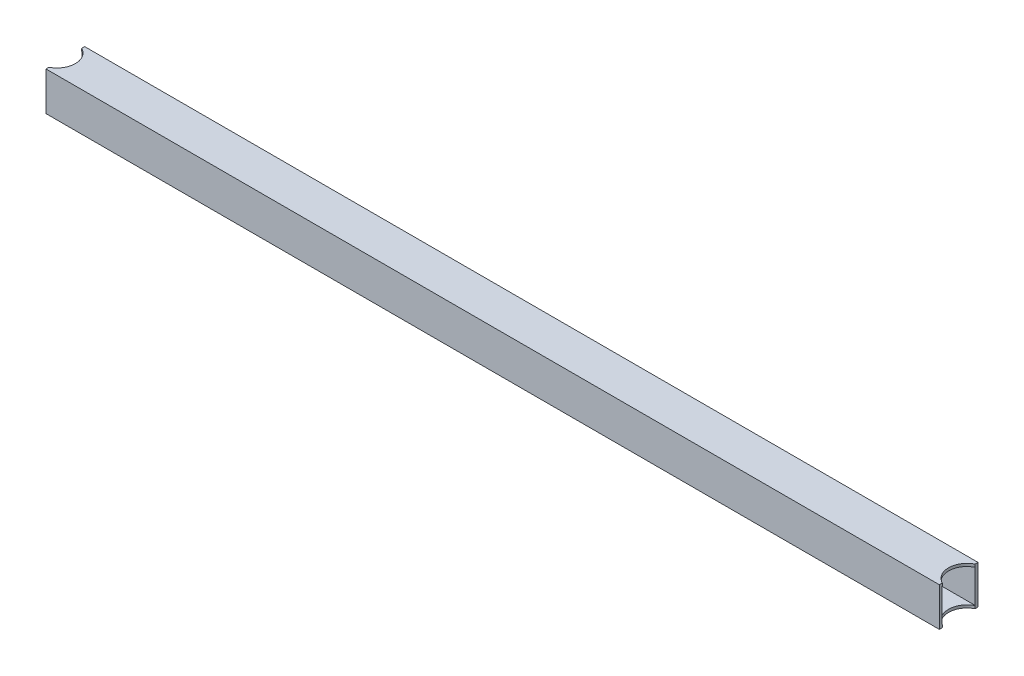
ISO-10303-21;
HEADER;
FILE_DESCRIPTION(('STEP AP214'),'2;1');
FILE_NAME('part.step','',(''),(''),'','','');
FILE_SCHEMA(('AUTOMOTIVE_DESIGN { 1 0 10303 214 1 1 1 1 }'));
ENDSEC;
DATA;
#1=APPLICATION_CONTEXT('core data for automotive mechanical design processes');
#2=APPLICATION_PROTOCOL_DEFINITION('international standard','automotive_design',2000,#1);
#3=PRODUCT_CONTEXT('',#1,'mechanical');
#4=PRODUCT('Part','Part','',(#3));
#5=PRODUCT_RELATED_PRODUCT_CATEGORY('part','',(#4));
#6=PRODUCT_DEFINITION_FORMATION('','',#4);
#7=PRODUCT_DEFINITION_CONTEXT('part definition',#1,'design');
#8=PRODUCT_DEFINITION('design','',#6,#7);
#9=PRODUCT_DEFINITION_SHAPE('','',#8);
#10=(LENGTH_UNIT() NAMED_UNIT(*) SI_UNIT(.MILLI.,.METRE.));
#11=(NAMED_UNIT(*) PLANE_ANGLE_UNIT() SI_UNIT($,.RADIAN.));
#12=(NAMED_UNIT(*) SI_UNIT($,.STERADIAN.) SOLID_ANGLE_UNIT());
#13=UNCERTAINTY_MEASURE_WITH_UNIT(LENGTH_MEASURE(1.E-05),#10,'distance_accuracy_value','');
#14=(GEOMETRIC_REPRESENTATION_CONTEXT(3) GLOBAL_UNCERTAINTY_ASSIGNED_CONTEXT((#13)) GLOBAL_UNIT_ASSIGNED_CONTEXT((#10,
#11,#12)) REPRESENTATION_CONTEXT('',''));
#15=CARTESIAN_POINT('',(0.,0.,0.));
#16=DIRECTION('',(0.,0.,1.));
#17=DIRECTION('',(1.,0.,0.));
#18=AXIS2_PLACEMENT_3D('',#15,#16,#17);
#19=CARTESIAN_POINT('',(522.605,44.45,0.));
#20=DIRECTION('',(0.,-1.,0.));
#21=DIRECTION('',(0.,0.,-1.));
#22=AXIS2_PLACEMENT_3D('',#19,#20,#21);
#23=CYLINDRICAL_SURFACE('',#22,21.0820000000003);
#24=DIRECTION('',(0.,-1.,0.));
#25=VECTOR('',#24,1.);
#26=CARTESIAN_POINT('',(513.08,44.45,-18.8075808917575));
#27=LINE('',#26,#25);
#28=CARTESIAN_POINT('',(513.08,3.17500000000004,-18.8075808917575));
#29=VERTEX_POINT('',#28);
#30=CARTESIAN_POINT('',(513.08,0.,-18.8075808917575));
#31=VERTEX_POINT('',#30);
#32=EDGE_CURVE('E272',#29,#31,#27,.T.);
#33=ORIENTED_EDGE('',*,*,#32,.F.);
#34=CARTESIAN_POINT('',(522.605,3.17500000000004,0.));
#35=DIRECTION('',(0.,-1.,0.));
#36=DIRECTION('',(0.,0.,-1.));
#37=AXIS2_PLACEMENT_3D('',#34,#35,#36);
#38=CIRCLE('',#37,21.0820000000003);
#39=CARTESIAN_POINT('',(513.08,3.17500000000004,18.8075808917578));
#40=VERTEX_POINT('',#39);
#41=EDGE_CURVE('E210',#29,#40,#38,.F.);
#42=ORIENTED_EDGE('',*,*,#41,.T.);
#43=DIRECTION('',(0.,-1.,0.));
#44=VECTOR('',#43,1.);
#45=CARTESIAN_POINT('',(513.08,44.45,18.8075808917575));
#46=LINE('',#45,#44);
#47=CARTESIAN_POINT('',(513.08,0.,18.8075808917575));
#48=VERTEX_POINT('',#47);
#49=EDGE_CURVE('E181',#40,#48,#46,.T.);
#50=ORIENTED_EDGE('',*,*,#49,.T.);
#51=CARTESIAN_POINT('',(522.605,0.,0.));
#52=DIRECTION('',(0.,1.,0.));
#53=DIRECTION('',(0.,0.,1.));
#54=AXIS2_PLACEMENT_3D('',#51,#52,#53);
#55=CIRCLE('',#54,21.0820000000003);
#56=EDGE_CURVE('E237',#48,#31,#55,.F.);
#57=ORIENTED_EDGE('',*,*,#56,.T.);
#58=EDGE_LOOP('',(#33,#42,#50,#57));
#59=FACE_BOUND('',#58,.T.);
#60=ADVANCED_FACE('F49',(#59),#23,.F.);
#61=CARTESIAN_POINT('',(-522.605,44.45,1.28369537222284E-13));
#62=DIRECTION('',(0.,-1.,0.));
#63=DIRECTION('',(0.,0.,-1.));
#64=AXIS2_PLACEMENT_3D('',#61,#62,#63);
#65=CYLINDRICAL_SURFACE('',#64,21.0819999999999);
#66=CARTESIAN_POINT('',(-522.605,3.17500000000004,1.28369537222284E-13));
#67=DIRECTION('',(0.,-1.,0.));
#68=DIRECTION('',(0.,0.,-1.));
#69=AXIS2_PLACEMENT_3D('',#66,#67,#68);
#70=CIRCLE('',#69,21.0819999999999);
#71=CARTESIAN_POINT('',(-513.08,3.17500000000004,-18.8075808917573));
#72=VERTEX_POINT('',#71);
#73=CARTESIAN_POINT('',(-513.08,3.17500000000004,18.8075808917576));
#74=VERTEX_POINT('',#73);
#75=EDGE_CURVE('E208',#72,#74,#70,.T.);
#76=ORIENTED_EDGE('',*,*,#75,.F.);
#77=DIRECTION('',(0.,-1.,0.));
#78=VECTOR('',#77,1.);
#79=CARTESIAN_POINT('',(-513.08,44.45,-18.8075808917574));
#80=LINE('',#79,#78);
#81=CARTESIAN_POINT('',(-513.08,0.,-18.8075808917574));
#82=VERTEX_POINT('',#81);
#83=EDGE_CURVE('E263',#72,#82,#80,.T.);
#84=ORIENTED_EDGE('',*,*,#83,.T.);
#85=CARTESIAN_POINT('',(-522.605,0.,1.28369537222284E-13));
#86=DIRECTION('',(0.,1.,0.));
#87=DIRECTION('',(0.,0.,1.));
#88=AXIS2_PLACEMENT_3D('',#85,#86,#87);
#89=CIRCLE('',#88,21.0819999999999);
#90=CARTESIAN_POINT('',(-513.08,0.,18.8075808917576));
#91=VERTEX_POINT('',#90);
#92=EDGE_CURVE('E248',#91,#82,#89,.T.);
#93=ORIENTED_EDGE('',*,*,#92,.F.);
#94=DIRECTION('',(0.,-1.,0.));
#95=VECTOR('',#94,1.);
#96=CARTESIAN_POINT('',(-513.08,44.45,18.8075808917576));
#97=LINE('',#96,#95);
#98=EDGE_CURVE('E259',#74,#91,#97,.T.);
#99=ORIENTED_EDGE('',*,*,#98,.F.);
#100=EDGE_LOOP('',(#76,#84,#93,#99));
#101=FACE_BOUND('',#100,.T.);
#102=ADVANCED_FACE('F300',(#101),#65,.F.);
#103=CARTESIAN_POINT('',(513.08,44.45,0.));
#104=DIRECTION('',(-1.,0.,0.));
#105=DIRECTION('',(0.,0.,1.));
#106=AXIS2_PLACEMENT_3D('',#103,#104,#105);
#107=PLANE('',#106);
#108=ORIENTED_EDGE('',*,*,#49,.F.);
#109=DIRECTION('',(0.,0.,1.));
#110=VECTOR('',#109,1.);
#111=CARTESIAN_POINT('',(513.08,3.17500000000004,-19.0499999999999));
#112=LINE('',#111,#110);
#113=CARTESIAN_POINT('',(513.08,3.17500000000004,19.0500000000002));
#114=VERTEX_POINT('',#113);
#115=EDGE_CURVE('E164',#40,#114,#112,.T.);
#116=ORIENTED_EDGE('',*,*,#115,.T.);
#117=DIRECTION('',(0.,1.,0.));
#118=VECTOR('',#117,1.);
#119=CARTESIAN_POINT('',(513.08,3.17500000000004,19.0500000000002));
#120=LINE('',#119,#118);
#121=CARTESIAN_POINT('',(513.08,41.2749999999999,19.0500000000002));
#122=VERTEX_POINT('',#121);
#123=EDGE_CURVE('E171',#114,#122,#120,.T.);
#124=ORIENTED_EDGE('',*,*,#123,.T.);
#125=DIRECTION('',(0.,0.,-1.));
#126=VECTOR('',#125,1.);
#127=CARTESIAN_POINT('',(513.08,41.2749999999999,-19.0499999999999));
#128=LINE('',#127,#126);
#129=CARTESIAN_POINT('',(513.08,41.2749999999999,18.8075808917578));
#130=VERTEX_POINT('',#129);
#131=EDGE_CURVE('E189',#122,#130,#128,.T.);
#132=ORIENTED_EDGE('',*,*,#131,.T.);
#133=CARTESIAN_POINT('',(513.08,44.45,18.8075808917575));
#134=VERTEX_POINT('',#133);
#135=EDGE_CURVE('E57',#134,#130,#46,.T.);
#136=ORIENTED_EDGE('',*,*,#135,.F.);
#137=DIRECTION('',(0.,0.,-1.));
#138=VECTOR('',#137,1.);
#139=CARTESIAN_POINT('',(513.08,44.45,0.));
#140=LINE('',#139,#138);
#141=CARTESIAN_POINT('',(513.08,44.45,22.225));
#142=VERTEX_POINT('',#141);
#143=EDGE_CURVE('E213',#142,#134,#140,.T.);
#144=ORIENTED_EDGE('',*,*,#143,.F.);
#145=DIRECTION('',(0.,-1.,0.));
#146=VECTOR('',#145,1.);
#147=CARTESIAN_POINT('',(513.08,44.45,22.225));
#148=LINE('',#147,#146);
#149=CARTESIAN_POINT('',(513.08,0.,22.225));
#150=VERTEX_POINT('',#149);
#151=EDGE_CURVE('E235',#142,#150,#148,.T.);
#152=ORIENTED_EDGE('',*,*,#151,.T.);
#153=DIRECTION('',(0.,0.,-1.));
#154=VECTOR('',#153,1.);
#155=CARTESIAN_POINT('',(513.08,0.,0.));
#156=LINE('',#155,#154);
#157=EDGE_CURVE('E212',#150,#48,#156,.T.);
#158=ORIENTED_EDGE('',*,*,#157,.T.);
#159=EDGE_LOOP('',(#108,#116,#124,#132,#136,#144,#152,#158));
#160=FACE_BOUND('',#159,.T.);
#161=ADVANCED_FACE('F51',(#160),#107,.F.);
#162=ORIENTED_EDGE('',*,*,#135,.T.);
#163=CARTESIAN_POINT('',(522.605,41.2749999999999,0.));
#164=DIRECTION('',(0.,1.,0.));
#165=DIRECTION('',(0.,0.,1.));
#166=AXIS2_PLACEMENT_3D('',#163,#164,#165);
#167=CIRCLE('',#166,21.0820000000003);
#168=CARTESIAN_POINT('',(513.08,41.2749999999999,-18.8075808917575));
#169=VERTEX_POINT('',#168);
#170=EDGE_CURVE('E205',#130,#169,#167,.F.);
#171=ORIENTED_EDGE('',*,*,#170,.T.);
#172=CARTESIAN_POINT('',(513.08,44.45,-18.8075808917575));
#173=VERTEX_POINT('',#172);
#174=EDGE_CURVE('E273',#173,#169,#27,.T.);
#175=ORIENTED_EDGE('',*,*,#174,.F.);
#176=CARTESIAN_POINT('',(522.605,44.45,0.));
#177=DIRECTION('',(0.,1.,0.));
#178=DIRECTION('',(0.,0.,1.));
#179=AXIS2_PLACEMENT_3D('',#176,#177,#178);
#180=CIRCLE('',#179,21.0820000000003);
#181=EDGE_CURVE('E216',#134,#173,#180,.F.);
#182=ORIENTED_EDGE('',*,*,#181,.F.);
#183=EDGE_LOOP('',(#162,#171,#175,#182));
#184=FACE_BOUND('',#183,.T.);
#185=ADVANCED_FACE('F326',(#184),#23,.F.);
#186=CARTESIAN_POINT('',(513.08,44.45,0.));
#187=DIRECTION('',(1.,0.,0.));
#188=DIRECTION('',(0.,0.,-1.));
#189=AXIS2_PLACEMENT_3D('',#186,#187,#188);
#190=PLANE('',#189);
#191=CARTESIAN_POINT('',(513.08,3.17500000000004,-19.0499999999999));
#192=VERTEX_POINT('',#191);
#193=EDGE_CURVE('E177',#192,#29,#112,.T.);
#194=ORIENTED_EDGE('',*,*,#193,.T.);
#195=ORIENTED_EDGE('',*,*,#32,.T.);
#196=DIRECTION('',(0.,0.,1.));
#197=VECTOR('',#196,1.);
#198=CARTESIAN_POINT('',(513.08,0.,0.));
#199=LINE('',#198,#197);
#200=CARTESIAN_POINT('',(513.08,0.,-22.225));
#201=VERTEX_POINT('',#200);
#202=EDGE_CURVE('E240',#201,#31,#199,.T.);
#203=ORIENTED_EDGE('',*,*,#202,.F.);
#204=DIRECTION('',(0.,-1.,0.));
#205=VECTOR('',#204,1.);
#206=CARTESIAN_POINT('',(513.08,44.45,-22.225));
#207=LINE('',#206,#205);
#208=CARTESIAN_POINT('',(513.08,44.45,-22.225));
#209=VERTEX_POINT('',#208);
#210=EDGE_CURVE('E270',#209,#201,#207,.T.);
#211=ORIENTED_EDGE('',*,*,#210,.F.);
#212=DIRECTION('',(0.,0.,1.));
#213=VECTOR('',#212,1.);
#214=CARTESIAN_POINT('',(513.08,44.45,0.));
#215=LINE('',#214,#213);
#216=EDGE_CURVE('E219',#209,#173,#215,.T.);
#217=ORIENTED_EDGE('',*,*,#216,.T.);
#218=ORIENTED_EDGE('',*,*,#174,.T.);
#219=CARTESIAN_POINT('',(513.08,41.2749999999999,-19.0499999999999));
#220=VERTEX_POINT('',#219);
#221=EDGE_CURVE('E176',#169,#220,#128,.T.);
#222=ORIENTED_EDGE('',*,*,#221,.T.);
#223=DIRECTION('',(0.,-1.,0.));
#224=VECTOR('',#223,1.);
#225=CARTESIAN_POINT('',(513.08,3.17500000000004,-19.0499999999999));
#226=LINE('',#225,#224);
#227=EDGE_CURVE('E64',#220,#192,#226,.T.);
#228=ORIENTED_EDGE('',*,*,#227,.T.);
#229=EDGE_LOOP('',(#194,#195,#203,#211,#217,#218,#222,#228));
#230=FACE_BOUND('',#229,.T.);
#231=ADVANCED_FACE('F309',(#230),#190,.T.);
#232=CARTESIAN_POINT('',(0.,44.45,-22.225));
#233=DIRECTION('',(0.,0.,1.));
#234=DIRECTION('',(1.,0.,0.));
#235=AXIS2_PLACEMENT_3D('',#232,#233,#234);
#236=PLANE('',#235);
#237=DIRECTION('',(-1.,0.,0.));
#238=VECTOR('',#237,1.);
#239=CARTESIAN_POINT('',(0.,0.,-22.225));
#240=LINE('',#239,#238);
#241=CARTESIAN_POINT('',(-513.08,0.,-22.2249999999999));
#242=VERTEX_POINT('',#241);
#243=EDGE_CURVE('E243',#201,#242,#240,.T.);
#244=ORIENTED_EDGE('',*,*,#243,.T.);
#245=DIRECTION('',(0.,-1.,0.));
#246=VECTOR('',#245,1.);
#247=CARTESIAN_POINT('',(-513.08,44.45,-22.2249999999999));
#248=LINE('',#247,#246);
#249=CARTESIAN_POINT('',(-513.08,44.45,-22.2249999999999));
#250=VERTEX_POINT('',#249);
#251=EDGE_CURVE('E267',#250,#242,#248,.T.);
#252=ORIENTED_EDGE('',*,*,#251,.F.);
#253=DIRECTION('',(-1.,0.,0.));
#254=VECTOR('',#253,1.);
#255=CARTESIAN_POINT('',(0.,44.45,-22.225));
#256=LINE('',#255,#254);
#257=EDGE_CURVE('E222',#209,#250,#256,.T.);
#258=ORIENTED_EDGE('',*,*,#257,.F.);
#259=ORIENTED_EDGE('',*,*,#210,.T.);
#260=EDGE_LOOP('',(#244,#252,#258,#259));
#261=FACE_BOUND('',#260,.T.);
#262=ADVANCED_FACE('F328',(#261),#236,.F.);
#263=CARTESIAN_POINT('',(-513.08,44.45,0.));
#264=DIRECTION('',(1.,0.,0.));
#265=DIRECTION('',(0.,0.,-1.));
#266=AXIS2_PLACEMENT_3D('',#263,#264,#265);
#267=PLANE('',#266);
#268=ORIENTED_EDGE('',*,*,#83,.F.);
#269=DIRECTION('',(0.,0.,1.));
#270=VECTOR('',#269,1.);
#271=CARTESIAN_POINT('',(-513.08,3.17500000000004,-19.0499999999999));
#272=LINE('',#271,#270);
#273=CARTESIAN_POINT('',(-513.08,3.17500000000004,-19.0499999999999));
#274=VERTEX_POINT('',#273);
#275=EDGE_CURVE('E192',#274,#72,#272,.T.);
#276=ORIENTED_EDGE('',*,*,#275,.F.);
#277=DIRECTION('',(0.,-1.,0.));
#278=VECTOR('',#277,1.);
#279=CARTESIAN_POINT('',(-513.08,3.17500000000004,-19.0499999999999));
#280=LINE('',#279,#278);
#281=CARTESIAN_POINT('',(-513.08,41.2749999999999,-19.0499999999999));
#282=VERTEX_POINT('',#281);
#283=EDGE_CURVE('E182',#282,#274,#280,.T.);
#284=ORIENTED_EDGE('',*,*,#283,.F.);
#285=DIRECTION('',(0.,0.,-1.));
#286=VECTOR('',#285,1.);
#287=CARTESIAN_POINT('',(-513.08,41.2749999999999,-19.0499999999999));
#288=LINE('',#287,#286);
#289=CARTESIAN_POINT('',(-513.08,41.2749999999999,-18.8075808917573));
#290=VERTEX_POINT('',#289);
#291=EDGE_CURVE('E196',#290,#282,#288,.T.);
#292=ORIENTED_EDGE('',*,*,#291,.F.);
#293=CARTESIAN_POINT('',(-513.08,44.45,-18.8075808917574));
#294=VERTEX_POINT('',#293);
#295=EDGE_CURVE('E264',#294,#290,#80,.T.);
#296=ORIENTED_EDGE('',*,*,#295,.F.);
#297=DIRECTION('',(0.,0.,1.));
#298=VECTOR('',#297,1.);
#299=CARTESIAN_POINT('',(-513.08,44.45,0.));
#300=LINE('',#299,#298);
#301=EDGE_CURVE('E224',#250,#294,#300,.T.);
#302=ORIENTED_EDGE('',*,*,#301,.F.);
#303=ORIENTED_EDGE('',*,*,#251,.T.);
#304=DIRECTION('',(0.,0.,1.));
#305=VECTOR('',#304,1.);
#306=CARTESIAN_POINT('',(-513.08,0.,0.));
#307=LINE('',#306,#305);
#308=EDGE_CURVE('E245',#242,#82,#307,.T.);
#309=ORIENTED_EDGE('',*,*,#308,.T.);
#310=EDGE_LOOP('',(#268,#276,#284,#292,#296,#302,#303,#309));
#311=FACE_BOUND('',#310,.T.);
#312=ADVANCED_FACE('F304',(#311),#267,.F.);
#313=CARTESIAN_POINT('',(-522.605,41.2749999999999,1.28369537222284E-13));
#314=DIRECTION('',(0.,1.,0.));
#315=DIRECTION('',(0.,0.,1.));
#316=AXIS2_PLACEMENT_3D('',#313,#314,#315);
#317=CIRCLE('',#316,21.0819999999999);
#318=CARTESIAN_POINT('',(-513.08,41.2749999999999,18.8075808917576));
#319=VERTEX_POINT('',#318);
#320=EDGE_CURVE('E200',#319,#290,#317,.T.);
#321=ORIENTED_EDGE('',*,*,#320,.F.);
#322=CARTESIAN_POINT('',(-513.08,44.45,18.8075808917576));
#323=VERTEX_POINT('',#322);
#324=EDGE_CURVE('E260',#323,#319,#97,.T.);
#325=ORIENTED_EDGE('',*,*,#324,.F.);
#326=CARTESIAN_POINT('',(-522.605,44.45,1.28369537222284E-13));
#327=DIRECTION('',(0.,1.,0.));
#328=DIRECTION('',(0.,0.,1.));
#329=AXIS2_PLACEMENT_3D('',#326,#327,#328);
#330=CIRCLE('',#329,21.0819999999999);
#331=EDGE_CURVE('E226',#323,#294,#330,.T.);
#332=ORIENTED_EDGE('',*,*,#331,.T.);
#333=ORIENTED_EDGE('',*,*,#295,.T.);
#334=EDGE_LOOP('',(#321,#325,#332,#333));
#335=FACE_BOUND('',#334,.T.);
#336=ADVANCED_FACE('F319',(#335),#65,.F.);
#337=CARTESIAN_POINT('',(-513.08,44.45,0.));
#338=DIRECTION('',(-1.,0.,0.));
#339=DIRECTION('',(0.,0.,1.));
#340=AXIS2_PLACEMENT_3D('',#337,#338,#339);
#341=PLANE('',#340);
#342=DIRECTION('',(0.,0.,1.));
#343=VECTOR('',#342,1.);
#344=CARTESIAN_POINT('',(-513.08,3.17500000000004,0.));
#345=LINE('',#344,#343);
#346=CARTESIAN_POINT('',(-513.08,3.17500000000004,19.0500000000002));
#347=VERTEX_POINT('',#346);
#348=EDGE_CURVE('E13',#74,#347,#345,.T.);
#349=ORIENTED_EDGE('',*,*,#348,.F.);
#350=ORIENTED_EDGE('',*,*,#98,.T.);
#351=DIRECTION('',(0.,0.,-1.));
#352=VECTOR('',#351,1.);
#353=CARTESIAN_POINT('',(-513.08,0.,0.));
#354=LINE('',#353,#352);
#355=CARTESIAN_POINT('',(-513.08,0.,22.2250000000002));
#356=VERTEX_POINT('',#355);
#357=EDGE_CURVE('E251',#356,#91,#354,.T.);
#358=ORIENTED_EDGE('',*,*,#357,.F.);
#359=DIRECTION('',(0.,-1.,0.));
#360=VECTOR('',#359,1.);
#361=CARTESIAN_POINT('',(-513.08,44.45,22.2250000000002));
#362=LINE('',#361,#360);
#363=CARTESIAN_POINT('',(-513.08,44.45,22.2250000000002));
#364=VERTEX_POINT('',#363);
#365=EDGE_CURVE('E257',#364,#356,#362,.T.);
#366=ORIENTED_EDGE('',*,*,#365,.F.);
#367=DIRECTION('',(0.,0.,-1.));
#368=VECTOR('',#367,1.);
#369=CARTESIAN_POINT('',(-513.08,44.45,0.));
#370=LINE('',#369,#368);
#371=EDGE_CURVE('E229',#364,#323,#370,.T.);
#372=ORIENTED_EDGE('',*,*,#371,.T.);
#373=ORIENTED_EDGE('',*,*,#324,.T.);
#374=CARTESIAN_POINT('',(-513.08,41.2749999999999,19.0500000000002));
#375=VERTEX_POINT('',#374);
#376=EDGE_CURVE('E186',#375,#319,#288,.T.);
#377=ORIENTED_EDGE('',*,*,#376,.F.);
#378=DIRECTION('',(0.,1.,0.));
#379=VECTOR('',#378,1.);
#380=CARTESIAN_POINT('',(-513.08,3.17500000000004,19.0500000000002));
#381=LINE('',#380,#379);
#382=EDGE_CURVE('E194',#347,#375,#381,.T.);
#383=ORIENTED_EDGE('',*,*,#382,.F.);
#384=EDGE_LOOP('',(#349,#350,#358,#366,#372,#373,#377,#383));
#385=FACE_BOUND('',#384,.T.);
#386=ADVANCED_FACE('F295',(#385),#341,.T.);
#387=CARTESIAN_POINT('',(0.,44.45,22.2250000000001));
#388=DIRECTION('',(0.,0.,1.));
#389=DIRECTION('',(1.,0.,0.));
#390=AXIS2_PLACEMENT_3D('',#387,#388,#389);
#391=PLANE('',#390);
#392=DIRECTION('',(-1.,0.,0.));
#393=VECTOR('',#392,1.);
#394=CARTESIAN_POINT('',(0.,0.,22.2250000000001));
#395=LINE('',#394,#393);
#396=EDGE_CURVE('E217',#150,#356,#395,.T.);
#397=ORIENTED_EDGE('',*,*,#396,.F.);
#398=ORIENTED_EDGE('',*,*,#151,.F.);
#399=DIRECTION('',(-1.,0.,0.));
#400=VECTOR('',#399,1.);
#401=CARTESIAN_POINT('',(0.,44.45,22.2250000000001));
#402=LINE('',#401,#400);
#403=EDGE_CURVE('E232',#142,#364,#402,.T.);
#404=ORIENTED_EDGE('',*,*,#403,.T.);
#405=ORIENTED_EDGE('',*,*,#365,.T.);
#406=EDGE_LOOP('',(#397,#398,#404,#405));
#407=FACE_BOUND('',#406,.T.);
#408=ADVANCED_FACE('F290',(#407),#391,.T.);
#409=CARTESIAN_POINT('',(0.,44.45,0.));
#410=DIRECTION('',(0.,1.,0.));
#411=DIRECTION('',(0.,0.,1.));
#412=AXIS2_PLACEMENT_3D('',#409,#410,#411);
#413=PLANE('',#412);
#414=ORIENTED_EDGE('',*,*,#143,.T.);
#415=ORIENTED_EDGE('',*,*,#181,.T.);
#416=ORIENTED_EDGE('',*,*,#216,.F.);
#417=ORIENTED_EDGE('',*,*,#257,.T.);
#418=ORIENTED_EDGE('',*,*,#301,.T.);
#419=ORIENTED_EDGE('',*,*,#331,.F.);
#420=ORIENTED_EDGE('',*,*,#371,.F.);
#421=ORIENTED_EDGE('',*,*,#403,.F.);
#422=EDGE_LOOP('',(#414,#415,#416,#417,#418,#419,#420,#421));
#423=FACE_BOUND('',#422,.T.);
#424=ADVANCED_FACE('F322',(#423),#413,.T.);
#425=CARTESIAN_POINT('',(0.,0.,0.));
#426=DIRECTION('',(0.,1.,0.));
#427=DIRECTION('',(0.,0.,1.));
#428=AXIS2_PLACEMENT_3D('',#425,#426,#427);
#429=PLANE('',#428);
#430=ORIENTED_EDGE('',*,*,#157,.F.);
#431=ORIENTED_EDGE('',*,*,#396,.T.);
#432=ORIENTED_EDGE('',*,*,#357,.T.);
#433=ORIENTED_EDGE('',*,*,#92,.T.);
#434=ORIENTED_EDGE('',*,*,#308,.F.);
#435=ORIENTED_EDGE('',*,*,#243,.F.);
#436=ORIENTED_EDGE('',*,*,#202,.T.);
#437=ORIENTED_EDGE('',*,*,#56,.F.);
#438=EDGE_LOOP('',(#430,#431,#432,#433,#434,#435,#436,#437));
#439=FACE_BOUND('',#438,.T.);
#440=ADVANCED_FACE('F283',(#439),#429,.F.);
#441=CARTESIAN_POINT('',(513.08,3.17500000000004,-19.0499999999999));
#442=DIRECTION('',(0.,-1.,0.));
#443=DIRECTION('',(0.,0.,-1.));
#444=AXIS2_PLACEMENT_3D('',#441,#442,#443);
#445=PLANE('',#444);
#446=ORIENTED_EDGE('',*,*,#193,.F.);
#447=DIRECTION('',(-1.,0.,0.));
#448=VECTOR('',#447,1.);
#449=CARTESIAN_POINT('',(513.08,3.17500000000004,-19.0499999999999));
#450=LINE('',#449,#448);
#451=EDGE_CURVE('E198',#192,#274,#450,.T.);
#452=ORIENTED_EDGE('',*,*,#451,.T.);
#453=ORIENTED_EDGE('',*,*,#275,.T.);
#454=ORIENTED_EDGE('',*,*,#75,.T.);
#455=ORIENTED_EDGE('',*,*,#348,.T.);
#456=DIRECTION('',(-1.,0.,0.));
#457=VECTOR('',#456,1.);
#458=CARTESIAN_POINT('',(513.08,3.17500000000004,19.0500000000002));
#459=LINE('',#458,#457);
#460=EDGE_CURVE('E72',#114,#347,#459,.T.);
#461=ORIENTED_EDGE('',*,*,#460,.F.);
#462=ORIENTED_EDGE('',*,*,#115,.F.);
#463=ORIENTED_EDGE('',*,*,#41,.F.);
#464=EDGE_LOOP('',(#446,#452,#453,#454,#455,#461,#462,#463));
#465=FACE_BOUND('',#464,.T.);
#466=ADVANCED_FACE('F162',(#465),#445,.F.);
#467=CARTESIAN_POINT('',(513.08,41.2749999999999,-19.0499999999999));
#468=DIRECTION('',(0.,1.,0.));
#469=DIRECTION('',(0.,0.,1.));
#470=AXIS2_PLACEMENT_3D('',#467,#468,#469);
#471=PLANE('',#470);
#472=ORIENTED_EDGE('',*,*,#131,.F.);
#473=DIRECTION('',(-1.,0.,0.));
#474=VECTOR('',#473,1.);
#475=CARTESIAN_POINT('',(513.08,41.2749999999999,19.0500000000002));
#476=LINE('',#475,#474);
#477=EDGE_CURVE('E168',#122,#375,#476,.T.);
#478=ORIENTED_EDGE('',*,*,#477,.T.);
#479=ORIENTED_EDGE('',*,*,#376,.T.);
#480=ORIENTED_EDGE('',*,*,#320,.T.);
#481=ORIENTED_EDGE('',*,*,#291,.T.);
#482=DIRECTION('',(-1.,0.,0.));
#483=VECTOR('',#482,1.);
#484=CARTESIAN_POINT('',(513.08,41.2749999999999,-19.0499999999999));
#485=LINE('',#484,#483);
#486=EDGE_CURVE('E201',#220,#282,#485,.T.);
#487=ORIENTED_EDGE('',*,*,#486,.F.);
#488=ORIENTED_EDGE('',*,*,#221,.F.);
#489=ORIENTED_EDGE('',*,*,#170,.F.);
#490=EDGE_LOOP('',(#472,#478,#479,#480,#481,#487,#488,#489));
#491=FACE_BOUND('',#490,.T.);
#492=ADVANCED_FACE('F324',(#491),#471,.F.);
#493=CARTESIAN_POINT('',(513.08,3.17500000000004,-19.0499999999999));
#494=DIRECTION('',(0.,0.,-1.));
#495=DIRECTION('',(-1.,0.,0.));
#496=AXIS2_PLACEMENT_3D('',#493,#494,#495);
#497=PLANE('',#496);
#498=ORIENTED_EDGE('',*,*,#283,.T.);
#499=ORIENTED_EDGE('',*,*,#451,.F.);
#500=ORIENTED_EDGE('',*,*,#227,.F.);
#501=ORIENTED_EDGE('',*,*,#486,.T.);
#502=EDGE_LOOP('',(#498,#499,#500,#501));
#503=FACE_BOUND('',#502,.T.);
#504=ADVANCED_FACE('F313',(#503),#497,.F.);
#505=CARTESIAN_POINT('',(513.08,3.17500000000004,19.0500000000002));
#506=DIRECTION('',(0.,0.,1.));
#507=DIRECTION('',(1.,0.,0.));
#508=AXIS2_PLACEMENT_3D('',#505,#506,#507);
#509=PLANE('',#508);
#510=ORIENTED_EDGE('',*,*,#382,.T.);
#511=ORIENTED_EDGE('',*,*,#477,.F.);
#512=ORIENTED_EDGE('',*,*,#123,.F.);
#513=ORIENTED_EDGE('',*,*,#460,.T.);
#514=EDGE_LOOP('',(#510,#511,#512,#513));
#515=FACE_BOUND('',#514,.T.);
#516=ADVANCED_FACE('F172',(#515),#509,.F.);
#517=CLOSED_SHELL('',(#60,#102,#161,#185,#231,#262,#312,#336,#386,#408,#424,#440,#466,#492,#504,#516));
#518=MANIFOLD_SOLID_BREP('B2',#517);
#519=ADVANCED_BREP_SHAPE_REPRESENTATION('',(#18,#518),#14);
#520=SHAPE_DEFINITION_REPRESENTATION(#9,#519);
ENDSEC;
END-ISO-10303-21;
